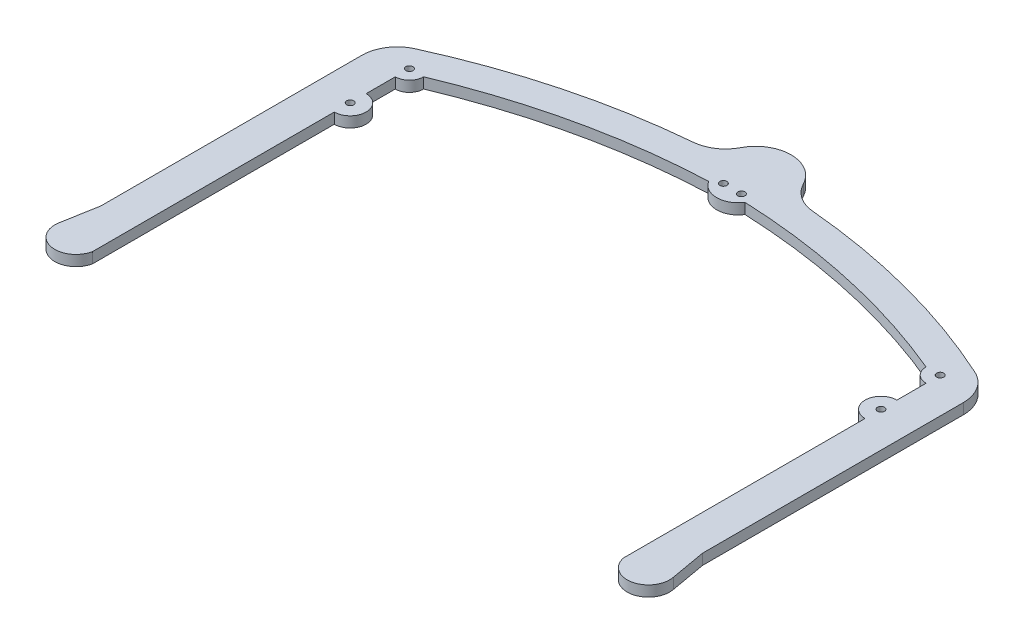
ISO-10303-21;
HEADER;
FILE_DESCRIPTION(('STEP AP214'),'2;1');
FILE_NAME('part.step','',(''),(''),'','','');
FILE_SCHEMA(('AUTOMOTIVE_DESIGN { 1 0 10303 214 1 1 1 1 }'));
ENDSEC;
DATA;
#1=APPLICATION_CONTEXT('core data for automotive mechanical design processes');
#2=APPLICATION_PROTOCOL_DEFINITION('international standard','automotive_design',2000,#1);
#3=PRODUCT_CONTEXT('',#1,'mechanical');
#4=PRODUCT('Part','Part','',(#3));
#5=PRODUCT_RELATED_PRODUCT_CATEGORY('part','',(#4));
#6=PRODUCT_DEFINITION_FORMATION('','',#4);
#7=PRODUCT_DEFINITION_CONTEXT('part definition',#1,'design');
#8=PRODUCT_DEFINITION('design','',#6,#7);
#9=PRODUCT_DEFINITION_SHAPE('','',#8);
#10=(LENGTH_UNIT() NAMED_UNIT(*) SI_UNIT(.MILLI.,.METRE.));
#11=(NAMED_UNIT(*) PLANE_ANGLE_UNIT() SI_UNIT($,.RADIAN.));
#12=(NAMED_UNIT(*) SI_UNIT($,.STERADIAN.) SOLID_ANGLE_UNIT());
#13=UNCERTAINTY_MEASURE_WITH_UNIT(LENGTH_MEASURE(1.E-05),#10,'distance_accuracy_value','');
#14=(GEOMETRIC_REPRESENTATION_CONTEXT(3) GLOBAL_UNCERTAINTY_ASSIGNED_CONTEXT((#13)) GLOBAL_UNIT_ASSIGNED_CONTEXT((#10,
#11,#12)) REPRESENTATION_CONTEXT('',''));
#15=CARTESIAN_POINT('',(0.,0.,0.));
#16=DIRECTION('',(0.,0.,1.));
#17=DIRECTION('',(1.,0.,0.));
#18=AXIS2_PLACEMENT_3D('',#15,#16,#17);
#19=CARTESIAN_POINT('',(-75.0000000000001,3.,-7.81240128822058E-13));
#20=DIRECTION('',(1.,0.,0.));
#21=DIRECTION('',(0.,0.,-1.));
#22=AXIS2_PLACEMENT_3D('',#19,#20,#21);
#23=PLANE('',#22);
#24=DIRECTION('',(0.,0.,1.));
#25=VECTOR('',#24,1.);
#26=CARTESIAN_POINT('',(-75.0000000000001,3.,-7.81240128822058E-13));
#27=LINE('',#26,#25);
#28=CARTESIAN_POINT('',(-74.9999999999991,3.,-90.3372231093292));
#29=VERTEX_POINT('',#28);
#30=CARTESIAN_POINT('',(-75.0000000000006,3.,-82.1033293861665));
#31=VERTEX_POINT('',#30);
#32=EDGE_CURVE('E205',#29,#31,#27,.T.);
#33=ORIENTED_EDGE('',*,*,#32,.T.);
#34=DIRECTION('',(0.,1.,0.));
#35=VECTOR('',#34,1.);
#36=CARTESIAN_POINT('',(-75.0000000000006,0.,-82.1033293861665));
#37=LINE('',#36,#35);
#38=CARTESIAN_POINT('',(-75.0000000000006,0.,-82.1033293861665));
#39=VERTEX_POINT('',#38);
#40=EDGE_CURVE('E196',#39,#31,#37,.T.);
#41=ORIENTED_EDGE('',*,*,#40,.F.);
#42=DIRECTION('',(0.,0.,1.));
#43=VECTOR('',#42,1.);
#44=CARTESIAN_POINT('',(-75.0000000000001,0.,-7.81240128822058E-13));
#45=LINE('',#44,#43);
#46=CARTESIAN_POINT('',(-74.9999999999991,0.,-90.3372231093292));
#47=VERTEX_POINT('',#46);
#48=EDGE_CURVE('E203',#47,#39,#45,.T.);
#49=ORIENTED_EDGE('',*,*,#48,.F.);
#50=DIRECTION('',(0.,1.,0.));
#51=VECTOR('',#50,1.);
#52=CARTESIAN_POINT('',(-75.0000000000006,0.,-90.3372231093292));
#53=LINE('',#52,#51);
#54=EDGE_CURVE('E58',#47,#29,#53,.T.);
#55=ORIENTED_EDGE('',*,*,#54,.T.);
#56=EDGE_LOOP('',(#33,#41,#49,#55));
#57=FACE_BOUND('',#56,.T.);
#58=ADVANCED_FACE('F35',(#57),#23,.T.);
#59=CARTESIAN_POINT('',(-74.9999999999993,0.,-73.1033293861664));
#60=VERTEX_POINT('',#59);
#61=CARTESIAN_POINT('',(-75.,0.,-4.81409491887797));
#62=VERTEX_POINT('',#61);
#63=EDGE_CURVE('E213',#60,#62,#45,.T.);
#64=ORIENTED_EDGE('',*,*,#63,.F.);
#65=DIRECTION('',(0.,1.,0.));
#66=VECTOR('',#65,1.);
#67=CARTESIAN_POINT('',(-75.0000000000005,0.,-73.1033293861664));
#68=LINE('',#67,#66);
#69=CARTESIAN_POINT('',(-75.0000000000005,3.,-73.1033293861664));
#70=VERTEX_POINT('',#69);
#71=EDGE_CURVE('E50',#60,#70,#68,.T.);
#72=ORIENTED_EDGE('',*,*,#71,.T.);
#73=CARTESIAN_POINT('',(-75.,3.,-4.81409491887797));
#74=VERTEX_POINT('',#73);
#75=EDGE_CURVE('E341',#70,#74,#27,.T.);
#76=ORIENTED_EDGE('',*,*,#75,.T.);
#77=DIRECTION('',(0.,-1.,0.));
#78=VECTOR('',#77,1.);
#79=CARTESIAN_POINT('',(-75.,3.,-4.81409491887797));
#80=LINE('',#79,#78);
#81=EDGE_CURVE('E221',#74,#62,#80,.T.);
#82=ORIENTED_EDGE('',*,*,#81,.T.);
#83=EDGE_LOOP('',(#64,#72,#76,#82));
#84=FACE_BOUND('',#83,.T.);
#85=ADVANCED_FACE('F377',(#84),#23,.T.);
#86=CARTESIAN_POINT('',(2.8095896277878,3.,81.4183887611817));
#87=DIRECTION('',(0.,-1.,0.));
#88=DIRECTION('',(0.,0.,-1.));
#89=AXIS2_PLACEMENT_3D('',#86,#87,#88);
#90=CYLINDRICAL_SURFACE('',#89,190.625);
#91=CARTESIAN_POINT('',(2.8095896277878,3.,81.4183887611817));
#92=DIRECTION('',(0.,-1.,0.));
#93=DIRECTION('',(0.,0.,1.));
#94=AXIS2_PLACEMENT_3D('',#91,#92,#93);
#95=CIRCLE('',#94,190.625);
#96=CARTESIAN_POINT('',(-5.11037617875689,3.,-109.042013334958));
#97=VERTEX_POINT('',#96);
#98=CARTESIAN_POINT('',(-71.0000000000003,3.,-94.337223109329));
#99=VERTEX_POINT('',#98);
#100=EDGE_CURVE('E225',#97,#99,#95,.F.);
#101=ORIENTED_EDGE('',*,*,#100,.T.);
#102=DIRECTION('',(0.,1.,0.));
#103=VECTOR('',#102,1.);
#104=CARTESIAN_POINT('',(-71.0000000000001,0.,-94.3372231093286));
#105=LINE('',#104,#103);
#106=CARTESIAN_POINT('',(-71.0000000000003,0.,-94.337223109329));
#107=VERTEX_POINT('',#106);
#108=EDGE_CURVE('E495',#107,#99,#105,.T.);
#109=ORIENTED_EDGE('',*,*,#108,.F.);
#110=CARTESIAN_POINT('',(2.8095896277878,0.,81.4183887611817));
#111=DIRECTION('',(0.,-1.,0.));
#112=DIRECTION('',(0.,0.,1.));
#113=AXIS2_PLACEMENT_3D('',#110,#111,#112);
#114=CIRCLE('',#113,190.625);
#115=CARTESIAN_POINT('',(-5.11037617875689,0.,-109.042013334958));
#116=VERTEX_POINT('',#115);
#117=EDGE_CURVE('E212',#116,#107,#114,.F.);
#118=ORIENTED_EDGE('',*,*,#117,.F.);
#119=DIRECTION('',(0.,1.,0.));
#120=VECTOR('',#119,1.);
#121=CARTESIAN_POINT('',(-5.11037617875712,0.,-109.042013334958));
#122=LINE('',#121,#120);
#123=EDGE_CURVE('E469',#116,#97,#122,.T.);
#124=ORIENTED_EDGE('',*,*,#123,.T.);
#125=EDGE_LOOP('',(#101,#109,#118,#124));
#126=FACE_BOUND('',#125,.T.);
#127=ADVANCED_FACE('F382',(#126),#90,.F.);
#128=CARTESIAN_POINT('',(75.0000000000001,3.,0.));
#129=DIRECTION('',(1.,0.,0.));
#130=DIRECTION('',(0.,0.,-1.));
#131=AXIS2_PLACEMENT_3D('',#128,#129,#130);
#132=PLANE('',#131);
#133=DIRECTION('',(0.,0.,1.));
#134=VECTOR('',#133,1.);
#135=CARTESIAN_POINT('',(75.0000000000001,0.,0.));
#136=LINE('',#135,#134);
#137=CARTESIAN_POINT('',(75.,0.,-90.3372231093297));
#138=VERTEX_POINT('',#137);
#139=CARTESIAN_POINT('',(75.,0.,-82.103329386167));
#140=VERTEX_POINT('',#139);
#141=EDGE_CURVE('E256',#138,#140,#136,.T.);
#142=ORIENTED_EDGE('',*,*,#141,.T.);
#143=DIRECTION('',(0.,1.,0.));
#144=VECTOR('',#143,1.);
#145=CARTESIAN_POINT('',(75.,0.,-82.103329386167));
#146=LINE('',#145,#144);
#147=CARTESIAN_POINT('',(75.,3.,-82.103329386167));
#148=VERTEX_POINT('',#147);
#149=EDGE_CURVE('E461',#140,#148,#146,.T.);
#150=ORIENTED_EDGE('',*,*,#149,.T.);
#151=DIRECTION('',(0.,0.,1.));
#152=VECTOR('',#151,1.);
#153=CARTESIAN_POINT('',(75.0000000000001,3.,0.));
#154=LINE('',#153,#152);
#155=CARTESIAN_POINT('',(75.,3.,-90.3372231093297));
#156=VERTEX_POINT('',#155);
#157=EDGE_CURVE('E238',#156,#148,#154,.T.);
#158=ORIENTED_EDGE('',*,*,#157,.F.);
#159=DIRECTION('',(0.,1.,0.));
#160=VECTOR('',#159,1.);
#161=CARTESIAN_POINT('',(75.,0.,-90.3372231093297));
#162=LINE('',#161,#160);
#163=EDGE_CURVE('E480',#138,#156,#162,.T.);
#164=ORIENTED_EDGE('',*,*,#163,.F.);
#165=EDGE_LOOP('',(#142,#150,#158,#164));
#166=FACE_BOUND('',#165,.T.);
#167=ADVANCED_FACE('F422',(#166),#132,.F.);
#168=CARTESIAN_POINT('',(-2.80958962778857,3.,81.4183887611817));
#169=DIRECTION('',(0.,-1.,0.));
#170=DIRECTION('',(0.,0.,-1.));
#171=AXIS2_PLACEMENT_3D('',#168,#169,#170);
#172=CYLINDRICAL_SURFACE('',#171,190.625);
#173=CARTESIAN_POINT('',(-2.80958962778857,0.,81.4183887611817));
#174=DIRECTION('',(0.,1.,0.));
#175=DIRECTION('',(0.,0.,1.));
#176=AXIS2_PLACEMENT_3D('',#173,#174,#175);
#177=CIRCLE('',#176,190.625);
#178=CARTESIAN_POINT('',(5.11037617875639,0.,-109.042013334958));
#179=VERTEX_POINT('',#178);
#180=CARTESIAN_POINT('',(70.9999999999995,0.,-94.3372231093291));
#181=VERTEX_POINT('',#180);
#182=EDGE_CURVE('E253',#179,#181,#177,.F.);
#183=ORIENTED_EDGE('',*,*,#182,.T.);
#184=DIRECTION('',(0.,1.,0.));
#185=VECTOR('',#184,1.);
#186=CARTESIAN_POINT('',(70.9999999999995,0.,-94.3372231093291));
#187=LINE('',#186,#185);
#188=CARTESIAN_POINT('',(70.9999999999995,3.,-94.3372231093291));
#189=VERTEX_POINT('',#188);
#190=EDGE_CURVE('E477',#181,#189,#187,.T.);
#191=ORIENTED_EDGE('',*,*,#190,.T.);
#192=CARTESIAN_POINT('',(-2.80958962778857,3.,81.4183887611817));
#193=DIRECTION('',(0.,1.,0.));
#194=DIRECTION('',(0.,0.,1.));
#195=AXIS2_PLACEMENT_3D('',#192,#193,#194);
#196=CIRCLE('',#195,190.625);
#197=CARTESIAN_POINT('',(5.11037617875639,3.,-109.042013334958));
#198=VERTEX_POINT('',#197);
#199=EDGE_CURVE('E233',#198,#189,#196,.F.);
#200=ORIENTED_EDGE('',*,*,#199,.F.);
#201=DIRECTION('',(0.,1.,0.));
#202=VECTOR('',#201,1.);
#203=CARTESIAN_POINT('',(5.11037617875639,0.,-109.042013334958));
#204=LINE('',#203,#202);
#205=EDGE_CURVE('E334',#179,#198,#204,.T.);
#206=ORIENTED_EDGE('',*,*,#205,.F.);
#207=EDGE_LOOP('',(#183,#191,#200,#206));
#208=FACE_BOUND('',#207,.T.);
#209=ADVANCED_FACE('F423',(#208),#172,.F.);
#210=CARTESIAN_POINT('',(0.,3.,-117.185905081123));
#211=DIRECTION('',(0.,-1.,0.));
#212=DIRECTION('',(0.,0.,-1.));
#213=AXIS2_PLACEMENT_3D('',#210,#211,#212);
#214=CYLINDRICAL_SURFACE('',#213,10.);
#215=CARTESIAN_POINT('',(0.,0.,-117.185905081123));
#216=DIRECTION('',(0.,1.,0.));
#217=DIRECTION('',(0.,0.,1.));
#218=AXIS2_PLACEMENT_3D('',#215,#216,#217);
#219=CIRCLE('',#218,10.);
#220=CARTESIAN_POINT('',(-8.87578893011517,0.,-121.792462458172));
#221=VERTEX_POINT('',#220);
#222=CARTESIAN_POINT('',(8.87578893011505,0.,-121.792462458172));
#223=VERTEX_POINT('',#222);
#224=EDGE_CURVE('E230',#221,#223,#219,.F.);
#225=ORIENTED_EDGE('',*,*,#224,.F.);
#226=DIRECTION('',(0.,-1.,0.));
#227=VECTOR('',#226,1.);
#228=CARTESIAN_POINT('',(-8.87578893011517,3.,-121.792462458172));
#229=LINE('',#228,#227);
#230=CARTESIAN_POINT('',(-8.87578893011517,3.,-121.792462458172));
#231=VERTEX_POINT('',#230);
#232=EDGE_CURVE('E299',#221,#231,#229,.F.);
#233=ORIENTED_EDGE('',*,*,#232,.T.);
#234=CARTESIAN_POINT('',(0.,3.,-117.185905081123));
#235=DIRECTION('',(0.,1.,0.));
#236=DIRECTION('',(0.,0.,1.));
#237=AXIS2_PLACEMENT_3D('',#234,#235,#236);
#238=CIRCLE('',#237,10.);
#239=CARTESIAN_POINT('',(8.87578893011505,3.,-121.792462458172));
#240=VERTEX_POINT('',#239);
#241=EDGE_CURVE('E231',#231,#240,#238,.F.);
#242=ORIENTED_EDGE('',*,*,#241,.T.);
#243=DIRECTION('',(0.,-1.,0.));
#244=VECTOR('',#243,1.);
#245=CARTESIAN_POINT('',(8.87578893011506,3.,-121.792462458172));
#246=LINE('',#245,#244);
#247=EDGE_CURVE('E275',#240,#223,#246,.T.);
#248=ORIENTED_EDGE('',*,*,#247,.T.);
#249=EDGE_LOOP('',(#225,#233,#242,#248));
#250=FACE_BOUND('',#249,.T.);
#251=ADVANCED_FACE('F316',(#250),#214,.T.);
#252=CARTESIAN_POINT('',(75.,3.,-73.1033293861669));
#253=VERTEX_POINT('',#252);
#254=CARTESIAN_POINT('',(75.0000000000001,3.,-4.81409491887726));
#255=VERTEX_POINT('',#254);
#256=EDGE_CURVE('E237',#253,#255,#154,.T.);
#257=ORIENTED_EDGE('',*,*,#256,.F.);
#258=DIRECTION('',(0.,1.,0.));
#259=VECTOR('',#258,1.);
#260=CARTESIAN_POINT('',(75.,0.,-73.1033293861669));
#261=LINE('',#260,#259);
#262=CARTESIAN_POINT('',(75.,0.,-73.1033293861669));
#263=VERTEX_POINT('',#262);
#264=EDGE_CURVE('E455',#263,#253,#261,.T.);
#265=ORIENTED_EDGE('',*,*,#264,.F.);
#266=CARTESIAN_POINT('',(75.0000000000001,0.,-4.81409491887726));
#267=VERTEX_POINT('',#266);
#268=EDGE_CURVE('E255',#263,#267,#136,.T.);
#269=ORIENTED_EDGE('',*,*,#268,.T.);
#270=DIRECTION('',(0.,-1.,0.));
#271=VECTOR('',#270,1.);
#272=CARTESIAN_POINT('',(75.0000000000001,3.,-4.81409491887726));
#273=LINE('',#272,#271);
#274=EDGE_CURVE('E272',#255,#267,#273,.T.);
#275=ORIENTED_EDGE('',*,*,#274,.F.);
#276=EDGE_LOOP('',(#257,#265,#269,#275));
#277=FACE_BOUND('',#276,.T.);
#278=ADVANCED_FACE('F417',(#277),#132,.F.);
#279=CARTESIAN_POINT('',(80.8816349035424,3.,-6.00000000000001));
#280=DIRECTION('',(0.,-1.,0.));
#281=DIRECTION('',(0.,0.,-1.));
#282=AXIS2_PLACEMENT_3D('',#279,#280,#281);
#283=CYLINDRICAL_SURFACE('',#282,6.00000000000001);
#284=CARTESIAN_POINT('',(80.8816349035424,0.,-6.00000000000001));
#285=DIRECTION('',(0.,1.,0.));
#286=DIRECTION('',(0.,0.,1.));
#287=AXIS2_PLACEMENT_3D('',#284,#285,#286);
#288=CIRCLE('',#287,6.00000000000001);
#289=CARTESIAN_POINT('',(86.7632698070847,0.,-7.18590508112276));
#290=VERTEX_POINT('',#289);
#291=EDGE_CURVE('E258',#267,#290,#288,.T.);
#292=ORIENTED_EDGE('',*,*,#291,.T.);
#293=DIRECTION('',(0.,-1.,0.));
#294=VECTOR('',#293,1.);
#295=CARTESIAN_POINT('',(86.7632698070847,3.,-7.18590508112276));
#296=LINE('',#295,#294);
#297=CARTESIAN_POINT('',(86.7632698070847,3.,-7.18590508112276));
#298=VERTEX_POINT('',#297);
#299=EDGE_CURVE('E270',#298,#290,#296,.T.);
#300=ORIENTED_EDGE('',*,*,#299,.F.);
#301=CARTESIAN_POINT('',(80.8816349035424,3.,-6.00000000000001));
#302=DIRECTION('',(0.,1.,0.));
#303=DIRECTION('',(0.,0.,1.));
#304=AXIS2_PLACEMENT_3D('',#301,#302,#303);
#305=CIRCLE('',#304,6.00000000000001);
#306=EDGE_CURVE('E241',#255,#298,#305,.T.);
#307=ORIENTED_EDGE('',*,*,#306,.F.);
#308=ORIENTED_EDGE('',*,*,#274,.T.);
#309=EDGE_LOOP('',(#292,#300,#307,#308));
#310=FACE_BOUND('',#309,.T.);
#311=ADVANCED_FACE('F413',(#310),#283,.T.);
#312=CARTESIAN_POINT('',(85.3758992429143,3.,-15.0540745387747));
#313=DIRECTION('',(0.984807753012205,0.,-0.173648177666948));
#314=DIRECTION('',(-0.173648177666948,0.,-0.984807753012205));
#315=AXIS2_PLACEMENT_3D('',#312,#313,#314);
#316=PLANE('',#315);
#317=DIRECTION('',(0.173648177666948,0.,0.984807753012205));
#318=VECTOR('',#317,1.);
#319=CARTESIAN_POINT('',(85.3758992429143,0.,-15.0540745387747));
#320=LINE('',#319,#318);
#321=CARTESIAN_POINT('',(85.,0.,-17.1859050811222));
#322=VERTEX_POINT('',#321);
#323=EDGE_CURVE('E261',#322,#290,#320,.T.);
#324=ORIENTED_EDGE('',*,*,#323,.F.);
#325=DIRECTION('',(0.,-1.,0.));
#326=VECTOR('',#325,1.);
#327=CARTESIAN_POINT('',(85.,3.,-17.1859050811222));
#328=LINE('',#327,#326);
#329=CARTESIAN_POINT('',(85.,3.,-17.1859050811222));
#330=VERTEX_POINT('',#329);
#331=EDGE_CURVE('E251',#330,#322,#328,.T.);
#332=ORIENTED_EDGE('',*,*,#331,.F.);
#333=DIRECTION('',(0.173648177666948,0.,0.984807753012205));
#334=VECTOR('',#333,1.);
#335=CARTESIAN_POINT('',(85.3758992429143,3.,-15.0540745387747));
#336=LINE('',#335,#334);
#337=EDGE_CURVE('E243',#330,#298,#336,.T.);
#338=ORIENTED_EDGE('',*,*,#337,.T.);
#339=ORIENTED_EDGE('',*,*,#299,.T.);
#340=EDGE_LOOP('',(#324,#332,#338,#339));
#341=FACE_BOUND('',#340,.T.);
#342=ADVANCED_FACE('F409',(#341),#316,.T.);
#343=CARTESIAN_POINT('',(85.,3.,0.));
#344=DIRECTION('',(1.,0.,0.));
#345=DIRECTION('',(0.,0.,-1.));
#346=AXIS2_PLACEMENT_3D('',#343,#344,#345);
#347=PLANE('',#346);
#348=DIRECTION('',(0.,0.,1.));
#349=VECTOR('',#348,1.);
#350=CARTESIAN_POINT('',(85.,0.,0.));
#351=LINE('',#350,#349);
#352=CARTESIAN_POINT('',(85.,0.,-90.8788609623958));
#353=VERTEX_POINT('',#352);
#354=EDGE_CURVE('E264',#353,#322,#351,.T.);
#355=ORIENTED_EDGE('',*,*,#354,.F.);
#356=DIRECTION('',(0.,-1.,0.));
#357=VECTOR('',#356,1.);
#358=CARTESIAN_POINT('',(85.,3.,-90.8788609623958));
#359=LINE('',#358,#357);
#360=CARTESIAN_POINT('',(85.,3.,-90.8788609623958));
#361=VERTEX_POINT('',#360);
#362=EDGE_CURVE('E285',#353,#361,#359,.F.);
#363=ORIENTED_EDGE('',*,*,#362,.T.);
#364=DIRECTION('',(0.,0.,1.));
#365=VECTOR('',#364,1.);
#366=CARTESIAN_POINT('',(85.,3.,0.));
#367=LINE('',#366,#365);
#368=EDGE_CURVE('E246',#361,#330,#367,.T.);
#369=ORIENTED_EDGE('',*,*,#368,.T.);
#370=ORIENTED_EDGE('',*,*,#331,.T.);
#371=EDGE_LOOP('',(#355,#363,#369,#370));
#372=FACE_BOUND('',#371,.T.);
#373=ADVANCED_FACE('F405',(#372),#347,.T.);
#374=CARTESIAN_POINT('',(0.,3.,73.4390949188776));
#375=DIRECTION('',(0.,-1.,0.));
#376=DIRECTION('',(0.,0.,-1.));
#377=AXIS2_PLACEMENT_3D('',#374,#375,#376);
#378=CYLINDRICAL_SURFACE('',#377,190.625);
#379=CARTESIAN_POINT('',(0.,0.,73.4390949188776));
#380=DIRECTION('',(0.,1.,0.));
#381=DIRECTION('',(0.,0.,1.));
#382=AXIS2_PLACEMENT_3D('',#379,#380,#381);
#383=CIRCLE('',#382,190.625);
#384=CARTESIAN_POINT('',(16.8667640104991,0.,-116.438241529721));
#385=VERTEX_POINT('',#384);
#386=CARTESIAN_POINT('',(79.1522491349481,0.,-99.9760488312552));
#387=VERTEX_POINT('',#386);
#388=EDGE_CURVE('E234',#385,#387,#383,.F.);
#389=ORIENTED_EDGE('',*,*,#388,.F.);
#390=DIRECTION('',(0.,-1.,0.));
#391=VECTOR('',#390,1.);
#392=CARTESIAN_POINT('',(16.8667640104991,3.,-116.438241529721));
#393=LINE('',#392,#391);
#394=CARTESIAN_POINT('',(16.8667640104991,3.,-116.438241529721));
#395=VERTEX_POINT('',#394);
#396=EDGE_CURVE('E281',#385,#395,#393,.F.);
#397=ORIENTED_EDGE('',*,*,#396,.T.);
#398=CARTESIAN_POINT('',(0.,3.,73.4390949188776));
#399=DIRECTION('',(0.,1.,0.));
#400=DIRECTION('',(0.,0.,1.));
#401=AXIS2_PLACEMENT_3D('',#398,#399,#400);
#402=CIRCLE('',#401,190.625);
#403=CARTESIAN_POINT('',(79.1522491349481,3.,-99.9760488312552));
#404=VERTEX_POINT('',#403);
#405=EDGE_CURVE('E248',#395,#404,#402,.F.);
#406=ORIENTED_EDGE('',*,*,#405,.T.);
#407=DIRECTION('',(0.,-1.,0.));
#408=VECTOR('',#407,1.);
#409=CARTESIAN_POINT('',(79.1522491349481,3.,-99.9760488312553));
#410=LINE('',#409,#408);
#411=EDGE_CURVE('E278',#404,#387,#410,.T.);
#412=ORIENTED_EDGE('',*,*,#411,.T.);
#413=EDGE_LOOP('',(#389,#397,#406,#412));
#414=FACE_BOUND('',#413,.T.);
#415=ADVANCED_FACE('F397',(#414),#378,.T.);
#416=CARTESIAN_POINT('',(0.,3.,0.));
#417=DIRECTION('',(0.,1.,0.));
#418=DIRECTION('',(0.,0.,1.));
#419=AXIS2_PLACEMENT_3D('',#416,#417,#418);
#420=PLANE('',#419);
#421=CARTESIAN_POINT('',(-2.55518808937819,3.,-110.61395920804));
#422=DIRECTION('',(0.,1.,0.));
#423=DIRECTION('',(0.,0.,1.));
#424=AXIS2_PLACEMENT_3D('',#421,#422,#423);
#425=CIRCLE('',#424,1.);
#426=CARTESIAN_POINT('',(-2.55518808937819,3.,-109.61395920804));
#427=VERTEX_POINT('',#426);
#428=EDGE_CURVE('E816',#427,#427,#425,.T.);
#429=ORIENTED_EDGE('',*,*,#428,.F.);
#430=EDGE_LOOP('',(#429));
#431=FACE_BOUND('',#430,.T.);
#432=CARTESIAN_POINT('',(-75.,3.,-94.3372231093291));
#433=DIRECTION('',(0.,1.,0.));
#434=DIRECTION('',(0.,0.,1.));
#435=AXIS2_PLACEMENT_3D('',#432,#433,#434);
#436=CIRCLE('',#435,1.);
#437=CARTESIAN_POINT('',(-75.,3.,-93.3372231093291));
#438=VERTEX_POINT('',#437);
#439=EDGE_CURVE('E810',#438,#438,#436,.T.);
#440=ORIENTED_EDGE('',*,*,#439,.F.);
#441=EDGE_LOOP('',(#440));
#442=FACE_BOUND('',#441,.T.);
#443=CARTESIAN_POINT('',(-75.,3.,-77.6033293861669));
#444=DIRECTION('',(0.,1.,0.));
#445=DIRECTION('',(0.,0.,1.));
#446=AXIS2_PLACEMENT_3D('',#443,#444,#445);
#447=CIRCLE('',#446,1.);
#448=CARTESIAN_POINT('',(-75.,3.,-76.6033293861669));
#449=VERTEX_POINT('',#448);
#450=EDGE_CURVE('E804',#449,#449,#447,.T.);
#451=ORIENTED_EDGE('',*,*,#450,.F.);
#452=EDGE_LOOP('',(#451));
#453=FACE_BOUND('',#452,.T.);
#454=CARTESIAN_POINT('',(2.55518808937819,3.,-110.61395920804));
#455=DIRECTION('',(0.,1.,0.));
#456=DIRECTION('',(0.,0.,1.));
#457=AXIS2_PLACEMENT_3D('',#454,#455,#456);
#458=CIRCLE('',#457,1.);
#459=CARTESIAN_POINT('',(2.55518808937819,3.,-109.61395920804));
#460=VERTEX_POINT('',#459);
#461=EDGE_CURVE('E798',#460,#460,#458,.T.);
#462=ORIENTED_EDGE('',*,*,#461,.F.);
#463=EDGE_LOOP('',(#462));
#464=FACE_BOUND('',#463,.T.);
#465=CARTESIAN_POINT('',(75.,3.,-94.3372231093291));
#466=DIRECTION('',(0.,1.,0.));
#467=DIRECTION('',(0.,0.,1.));
#468=AXIS2_PLACEMENT_3D('',#465,#466,#467);
#469=CIRCLE('',#468,1.);
#470=CARTESIAN_POINT('',(75.,3.,-93.3372231093291));
#471=VERTEX_POINT('',#470);
#472=EDGE_CURVE('E789',#471,#471,#469,.T.);
#473=ORIENTED_EDGE('',*,*,#472,.F.);
#474=EDGE_LOOP('',(#473));
#475=FACE_BOUND('',#474,.T.);
#476=CARTESIAN_POINT('',(75.,3.,-77.6033293861669));
#477=DIRECTION('',(0.,1.,0.));
#478=DIRECTION('',(0.,0.,1.));
#479=AXIS2_PLACEMENT_3D('',#476,#477,#478);
#480=CIRCLE('',#479,1.);
#481=CARTESIAN_POINT('',(75.,3.,-76.6033293861669));
#482=VERTEX_POINT('',#481);
#483=EDGE_CURVE('E783',#482,#482,#480,.T.);
#484=ORIENTED_EDGE('',*,*,#483,.F.);
#485=EDGE_LOOP('',(#484));
#486=FACE_BOUND('',#485,.T.);
#487=ORIENTED_EDGE('',*,*,#32,.F.);
#488=CARTESIAN_POINT('',(-75.0000000000007,3.,-94.3372231093292));
#489=DIRECTION('',(0.,-1.,0.));
#490=DIRECTION('',(0.,0.,1.));
#491=AXIS2_PLACEMENT_3D('',#488,#489,#490);
#492=CIRCLE('',#491,4.);
#493=EDGE_CURVE('E206',#99,#29,#492,.T.);
#494=ORIENTED_EDGE('',*,*,#493,.F.);
#495=ORIENTED_EDGE('',*,*,#100,.F.);
#496=CARTESIAN_POINT('',(0.,3.,-112.185905081123));
#497=DIRECTION('',(0.,1.,0.));
#498=DIRECTION('',(0.,0.,1.));
#499=AXIS2_PLACEMENT_3D('',#496,#497,#498);
#500=CIRCLE('',#499,6.);
#501=EDGE_CURVE('E483',#198,#97,#500,.F.);
#502=ORIENTED_EDGE('',*,*,#501,.F.);
#503=ORIENTED_EDGE('',*,*,#199,.T.);
#504=CARTESIAN_POINT('',(75.,3.,-94.3372231093297));
#505=DIRECTION('',(0.,1.,0.));
#506=DIRECTION('',(0.,0.,1.));
#507=AXIS2_PLACEMENT_3D('',#504,#505,#506);
#508=CIRCLE('',#507,4.);
#509=EDGE_CURVE('E460',#189,#156,#508,.T.);
#510=ORIENTED_EDGE('',*,*,#509,.T.);
#511=ORIENTED_EDGE('',*,*,#157,.T.);
#512=CARTESIAN_POINT('',(75.,3.,-77.6033293861669));
#513=DIRECTION('',(0.,1.,0.));
#514=DIRECTION('',(0.,0.,1.));
#515=AXIS2_PLACEMENT_3D('',#512,#513,#514);
#516=CIRCLE('',#515,4.50000000000002);
#517=EDGE_CURVE('E466',#148,#253,#516,.T.);
#518=ORIENTED_EDGE('',*,*,#517,.T.);
#519=ORIENTED_EDGE('',*,*,#256,.T.);
#520=ORIENTED_EDGE('',*,*,#306,.T.);
#521=ORIENTED_EDGE('',*,*,#337,.F.);
#522=ORIENTED_EDGE('',*,*,#368,.F.);
#523=CARTESIAN_POINT('',(75.,3.,-90.8788609623958));
#524=DIRECTION('',(0.,1.,0.));
#525=DIRECTION('',(0.,0.,1.));
#526=AXIS2_PLACEMENT_3D('',#523,#524,#525);
#527=CIRCLE('',#526,10.);
#528=EDGE_CURVE('E287',#361,#404,#527,.T.);
#529=ORIENTED_EDGE('',*,*,#528,.T.);
#530=ORIENTED_EDGE('',*,*,#405,.F.);
#531=CARTESIAN_POINT('',(17.7515778602302,3.,-126.399019835221));
#532=DIRECTION('',(0.,1.,0.));
#533=DIRECTION('',(0.,0.,1.));
#534=AXIS2_PLACEMENT_3D('',#531,#532,#533);
#535=CIRCLE('',#534,10.);
#536=EDGE_CURVE('E291',#395,#240,#535,.F.);
#537=ORIENTED_EDGE('',*,*,#536,.T.);
#538=ORIENTED_EDGE('',*,*,#241,.F.);
#539=CARTESIAN_POINT('',(-17.7515778602303,3.,-126.399019835221));
#540=DIRECTION('',(0.,1.,0.));
#541=DIRECTION('',(0.,0.,1.));
#542=AXIS2_PLACEMENT_3D('',#539,#540,#541);
#543=CIRCLE('',#542,10.);
#544=CARTESIAN_POINT('',(-16.8667640104992,3.,-116.438241529721));
#545=VERTEX_POINT('',#544);
#546=EDGE_CURVE('E11',#231,#545,#543,.F.);
#547=ORIENTED_EDGE('',*,*,#546,.T.);
#548=CARTESIAN_POINT('',(-6.95325064206448E-13,3.,73.4390949188776));
#549=DIRECTION('',(0.,-1.,0.));
#550=DIRECTION('',(0.,0.,1.));
#551=AXIS2_PLACEMENT_3D('',#548,#549,#550);
#552=CIRCLE('',#551,190.625);
#553=CARTESIAN_POINT('',(-79.1522491349472,3.,-99.976048831256));
#554=VERTEX_POINT('',#553);
#555=EDGE_CURVE('E215',#545,#554,#552,.F.);
#556=ORIENTED_EDGE('',*,*,#555,.T.);
#557=CARTESIAN_POINT('',(-74.9999999999992,3.,-90.8788609623965));
#558=DIRECTION('',(0.,1.,0.));
#559=DIRECTION('',(0.,0.,1.));
#560=AXIS2_PLACEMENT_3D('',#557,#558,#559);
#561=CIRCLE('',#560,10.);
#562=CARTESIAN_POINT('',(-84.9999999999992,3.,-90.8788609623966));
#563=VERTEX_POINT('',#562);
#564=EDGE_CURVE('E306',#554,#563,#561,.T.);
#565=ORIENTED_EDGE('',*,*,#564,.T.);
#566=DIRECTION('',(0.,0.,1.));
#567=VECTOR('',#566,1.);
#568=CARTESIAN_POINT('',(-85.,3.,-7.90039148556375E-13));
#569=LINE('',#568,#567);
#570=CARTESIAN_POINT('',(-84.9999999999998,3.,-17.185905081123));
#571=VERTEX_POINT('',#570);
#572=EDGE_CURVE('E329',#563,#571,#569,.T.);
#573=ORIENTED_EDGE('',*,*,#572,.T.);
#574=DIRECTION('',(-0.173648177666957,0.,0.984807753012203));
#575=VECTOR('',#574,1.);
#576=CARTESIAN_POINT('',(-85.3758992429141,3.,-15.0540745387755));
#577=LINE('',#576,#575);
#578=CARTESIAN_POINT('',(-86.7632698070847,3.,-7.18590508112358));
#579=VERTEX_POINT('',#578);
#580=EDGE_CURVE('E331',#571,#579,#577,.T.);
#581=ORIENTED_EDGE('',*,*,#580,.T.);
#582=CARTESIAN_POINT('',(-80.8816349035423,3.,-6.00000000000077));
#583=DIRECTION('',(0.,-1.,0.));
#584=DIRECTION('',(0.,0.,1.));
#585=AXIS2_PLACEMENT_3D('',#582,#583,#584);
#586=CIRCLE('',#585,6.00000000000001);
#587=EDGE_CURVE('E338',#74,#579,#586,.T.);
#588=ORIENTED_EDGE('',*,*,#587,.F.);
#589=ORIENTED_EDGE('',*,*,#75,.F.);
#590=CARTESIAN_POINT('',(-75.0000000000005,3.,-77.6033293861665));
#591=DIRECTION('',(0.,-1.,0.));
#592=DIRECTION('',(0.,0.,1.));
#593=AXIS2_PLACEMENT_3D('',#590,#591,#592);
#594=CIRCLE('',#593,4.50000000000002);
#595=EDGE_CURVE('E201',#31,#70,#594,.T.);
#596=ORIENTED_EDGE('',*,*,#595,.F.);
#597=EDGE_LOOP('',(#487,#494,#495,#502,#503,#510,#511,#518,#519,#520,#521,#522,#529,#530,#537,
#538,#547,#556,#565,#573,#581,#588,#589,#596));
#598=FACE_BOUND('',#597,.T.);
#599=ADVANCED_FACE('F324',(#431,#442,#453,#464,#475,#486,#598),#420,.T.);
#600=CARTESIAN_POINT('',(0.,0.,0.));
#601=DIRECTION('',(0.,1.,0.));
#602=DIRECTION('',(0.,0.,1.));
#603=AXIS2_PLACEMENT_3D('',#600,#601,#602);
#604=PLANE('',#603);
#605=CARTESIAN_POINT('',(-2.55518808937819,0.,-110.61395920804));
#606=DIRECTION('',(0.,1.,0.));
#607=DIRECTION('',(0.,0.,1.));
#608=AXIS2_PLACEMENT_3D('',#605,#606,#607);
#609=CIRCLE('',#608,0.999999999999999);
#610=CARTESIAN_POINT('',(-2.55518808937819,0.,-109.61395920804));
#611=VERTEX_POINT('',#610);
#612=EDGE_CURVE('E813',#611,#611,#609,.T.);
#613=ORIENTED_EDGE('',*,*,#612,.T.);
#614=EDGE_LOOP('',(#613));
#615=FACE_BOUND('',#614,.T.);
#616=CARTESIAN_POINT('',(-75.,0.,-94.3372231093291));
#617=DIRECTION('',(0.,1.,0.));
#618=DIRECTION('',(0.,0.,1.));
#619=AXIS2_PLACEMENT_3D('',#616,#617,#618);
#620=CIRCLE('',#619,1.);
#621=CARTESIAN_POINT('',(-75.,0.,-93.3372231093291));
#622=VERTEX_POINT('',#621);
#623=EDGE_CURVE('E807',#622,#622,#620,.T.);
#624=ORIENTED_EDGE('',*,*,#623,.T.);
#625=EDGE_LOOP('',(#624));
#626=FACE_BOUND('',#625,.T.);
#627=CARTESIAN_POINT('',(-75.,0.,-77.6033293861669));
#628=DIRECTION('',(0.,1.,0.));
#629=DIRECTION('',(0.,0.,1.));
#630=AXIS2_PLACEMENT_3D('',#627,#628,#629);
#631=CIRCLE('',#630,1.);
#632=CARTESIAN_POINT('',(-75.,0.,-76.6033293861669));
#633=VERTEX_POINT('',#632);
#634=EDGE_CURVE('E801',#633,#633,#631,.T.);
#635=ORIENTED_EDGE('',*,*,#634,.T.);
#636=EDGE_LOOP('',(#635));
#637=FACE_BOUND('',#636,.T.);
#638=CARTESIAN_POINT('',(2.55518808937819,0.,-110.61395920804));
#639=DIRECTION('',(0.,1.,0.));
#640=DIRECTION('',(0.,0.,1.));
#641=AXIS2_PLACEMENT_3D('',#638,#639,#640);
#642=CIRCLE('',#641,0.999999999999999);
#643=CARTESIAN_POINT('',(2.55518808937819,0.,-109.61395920804));
#644=VERTEX_POINT('',#643);
#645=EDGE_CURVE('E795',#644,#644,#642,.T.);
#646=ORIENTED_EDGE('',*,*,#645,.T.);
#647=EDGE_LOOP('',(#646));
#648=FACE_BOUND('',#647,.T.);
#649=CARTESIAN_POINT('',(75.,0.,-94.3372231093291));
#650=DIRECTION('',(0.,1.,0.));
#651=DIRECTION('',(0.,0.,1.));
#652=AXIS2_PLACEMENT_3D('',#649,#650,#651);
#653=CIRCLE('',#652,1.);
#654=CARTESIAN_POINT('',(75.,0.,-93.3372231093291));
#655=VERTEX_POINT('',#654);
#656=EDGE_CURVE('E785',#655,#655,#653,.T.);
#657=ORIENTED_EDGE('',*,*,#656,.T.);
#658=EDGE_LOOP('',(#657));
#659=FACE_BOUND('',#658,.T.);
#660=CARTESIAN_POINT('',(75.,0.,-77.6033293861669));
#661=DIRECTION('',(0.,1.,0.));
#662=DIRECTION('',(0.,0.,1.));
#663=AXIS2_PLACEMENT_3D('',#660,#661,#662);
#664=CIRCLE('',#663,1.);
#665=CARTESIAN_POINT('',(75.,0.,-76.6033293861669));
#666=VERTEX_POINT('',#665);
#667=EDGE_CURVE('E780',#666,#666,#664,.T.);
#668=ORIENTED_EDGE('',*,*,#667,.T.);
#669=EDGE_LOOP('',(#668));
#670=FACE_BOUND('',#669,.T.);
#671=CARTESIAN_POINT('',(-75.0000000000007,0.,-94.3372231093292));
#672=DIRECTION('',(0.,-1.,0.));
#673=DIRECTION('',(0.,0.,1.));
#674=AXIS2_PLACEMENT_3D('',#671,#672,#673);
#675=CIRCLE('',#674,4.);
#676=EDGE_CURVE('E211',#107,#47,#675,.T.);
#677=ORIENTED_EDGE('',*,*,#676,.T.);
#678=ORIENTED_EDGE('',*,*,#48,.T.);
#679=CARTESIAN_POINT('',(-75.0000000000005,0.,-77.6033293861665));
#680=DIRECTION('',(0.,-1.,0.));
#681=DIRECTION('',(0.,0.,1.));
#682=AXIS2_PLACEMENT_3D('',#679,#680,#681);
#683=CIRCLE('',#682,4.50000000000002);
#684=EDGE_CURVE('E193',#39,#60,#683,.T.);
#685=ORIENTED_EDGE('',*,*,#684,.T.);
#686=ORIENTED_EDGE('',*,*,#63,.T.);
#687=CARTESIAN_POINT('',(-80.8816349035423,0.,-6.00000000000077));
#688=DIRECTION('',(0.,-1.,0.));
#689=DIRECTION('',(0.,0.,1.));
#690=AXIS2_PLACEMENT_3D('',#687,#688,#689);
#691=CIRCLE('',#690,6.00000000000001);
#692=CARTESIAN_POINT('',(-86.7632698070847,0.,-7.18590508112358));
#693=VERTEX_POINT('',#692);
#694=EDGE_CURVE('E217',#62,#693,#691,.T.);
#695=ORIENTED_EDGE('',*,*,#694,.T.);
#696=DIRECTION('',(-0.173648177666957,0.,0.984807753012203));
#697=VECTOR('',#696,1.);
#698=CARTESIAN_POINT('',(-85.3758992429141,0.,-15.0540745387755));
#699=LINE('',#698,#697);
#700=CARTESIAN_POINT('',(-84.9999999999998,0.,-17.185905081123));
#701=VERTEX_POINT('',#700);
#702=EDGE_CURVE('E346',#701,#693,#699,.T.);
#703=ORIENTED_EDGE('',*,*,#702,.F.);
#704=DIRECTION('',(0.,0.,1.));
#705=VECTOR('',#704,1.);
#706=CARTESIAN_POINT('',(-85.,0.,-7.90039148556375E-13));
#707=LINE('',#706,#705);
#708=CARTESIAN_POINT('',(-84.9999999999992,0.,-90.8788609623966));
#709=VERTEX_POINT('',#708);
#710=EDGE_CURVE('E345',#709,#701,#707,.T.);
#711=ORIENTED_EDGE('',*,*,#710,.F.);
#712=CARTESIAN_POINT('',(-74.9999999999992,0.,-90.8788609623965));
#713=DIRECTION('',(0.,1.,0.));
#714=DIRECTION('',(0.,0.,1.));
#715=AXIS2_PLACEMENT_3D('',#712,#713,#714);
#716=CIRCLE('',#715,10.);
#717=CARTESIAN_POINT('',(-79.1522491349472,0.,-99.976048831256));
#718=VERTEX_POINT('',#717);
#719=EDGE_CURVE('E304',#709,#718,#716,.F.);
#720=ORIENTED_EDGE('',*,*,#719,.T.);
#721=CARTESIAN_POINT('',(-6.95325064206448E-13,0.,73.4390949188776));
#722=DIRECTION('',(0.,-1.,0.));
#723=DIRECTION('',(0.,0.,1.));
#724=AXIS2_PLACEMENT_3D('',#721,#722,#723);
#725=CIRCLE('',#724,190.625);
#726=CARTESIAN_POINT('',(-16.8667640104992,0.,-116.438241529721));
#727=VERTEX_POINT('',#726);
#728=EDGE_CURVE('E311',#727,#718,#725,.F.);
#729=ORIENTED_EDGE('',*,*,#728,.F.);
#730=CARTESIAN_POINT('',(-17.7515778602303,0.,-126.399019835221));
#731=DIRECTION('',(0.,1.,0.));
#732=DIRECTION('',(0.,0.,1.));
#733=AXIS2_PLACEMENT_3D('',#730,#731,#732);
#734=CIRCLE('',#733,10.);
#735=EDGE_CURVE('E43',#727,#221,#734,.T.);
#736=ORIENTED_EDGE('',*,*,#735,.T.);
#737=ORIENTED_EDGE('',*,*,#224,.T.);
#738=CARTESIAN_POINT('',(17.7515778602302,0.,-126.399019835221));
#739=DIRECTION('',(0.,1.,0.));
#740=DIRECTION('',(0.,0.,1.));
#741=AXIS2_PLACEMENT_3D('',#738,#739,#740);
#742=CIRCLE('',#741,10.);
#743=EDGE_CURVE('E289',#223,#385,#742,.T.);
#744=ORIENTED_EDGE('',*,*,#743,.T.);
#745=ORIENTED_EDGE('',*,*,#388,.T.);
#746=CARTESIAN_POINT('',(75.,0.,-90.8788609623958));
#747=DIRECTION('',(0.,1.,0.));
#748=DIRECTION('',(0.,0.,1.));
#749=AXIS2_PLACEMENT_3D('',#746,#747,#748);
#750=CIRCLE('',#749,10.);
#751=EDGE_CURVE('E283',#387,#353,#750,.F.);
#752=ORIENTED_EDGE('',*,*,#751,.T.);
#753=ORIENTED_EDGE('',*,*,#354,.T.);
#754=ORIENTED_EDGE('',*,*,#323,.T.);
#755=ORIENTED_EDGE('',*,*,#291,.F.);
#756=ORIENTED_EDGE('',*,*,#268,.F.);
#757=CARTESIAN_POINT('',(75.,0.,-77.6033293861669));
#758=DIRECTION('',(0.,1.,0.));
#759=DIRECTION('',(0.,0.,1.));
#760=AXIS2_PLACEMENT_3D('',#757,#758,#759);
#761=CIRCLE('',#760,4.50000000000002);
#762=EDGE_CURVE('E464',#140,#263,#761,.T.);
#763=ORIENTED_EDGE('',*,*,#762,.F.);
#764=ORIENTED_EDGE('',*,*,#141,.F.);
#765=CARTESIAN_POINT('',(75.,0.,-94.3372231093297));
#766=DIRECTION('',(0.,1.,0.));
#767=DIRECTION('',(0.,0.,1.));
#768=AXIS2_PLACEMENT_3D('',#765,#766,#767);
#769=CIRCLE('',#768,4.);
#770=EDGE_CURVE('E474',#181,#138,#769,.T.);
#771=ORIENTED_EDGE('',*,*,#770,.F.);
#772=ORIENTED_EDGE('',*,*,#182,.F.);
#773=CARTESIAN_POINT('',(0.,0.,-112.185905081123));
#774=DIRECTION('',(0.,1.,0.));
#775=DIRECTION('',(0.,0.,1.));
#776=AXIS2_PLACEMENT_3D('',#773,#774,#775);
#777=CIRCLE('',#776,6.);
#778=EDGE_CURVE('E485',#179,#116,#777,.F.);
#779=ORIENTED_EDGE('',*,*,#778,.T.);
#780=ORIENTED_EDGE('',*,*,#117,.T.);
#781=EDGE_LOOP('',(#677,#678,#685,#686,#695,#703,#711,#720,#729,#736,#737,#744,#745,#752,#753,
#754,#755,#756,#763,#764,#771,#772,#779,#780));
#782=FACE_BOUND('',#781,.T.);
#783=ADVANCED_FACE('F208',(#615,#626,#637,#648,#659,#670,#782),#604,.F.);
#784=CARTESIAN_POINT('',(17.7515778602302,3.,-126.399019835221));
#785=DIRECTION('',(0.,1.,0.));
#786=DIRECTION('',(0.,0.,1.));
#787=AXIS2_PLACEMENT_3D('',#784,#785,#786);
#788=CYLINDRICAL_SURFACE('',#787,10.);
#789=ORIENTED_EDGE('',*,*,#536,.F.);
#790=ORIENTED_EDGE('',*,*,#396,.F.);
#791=ORIENTED_EDGE('',*,*,#743,.F.);
#792=ORIENTED_EDGE('',*,*,#247,.F.);
#793=EDGE_LOOP('',(#789,#790,#791,#792));
#794=FACE_BOUND('',#793,.T.);
#795=ADVANCED_FACE('F401',(#794),#788,.F.);
#796=CARTESIAN_POINT('',(75.,3.,-90.8788609623958));
#797=DIRECTION('',(0.,-1.,0.));
#798=DIRECTION('',(0.,0.,-1.));
#799=AXIS2_PLACEMENT_3D('',#796,#797,#798);
#800=CYLINDRICAL_SURFACE('',#799,10.);
#801=ORIENTED_EDGE('',*,*,#528,.F.);
#802=ORIENTED_EDGE('',*,*,#362,.F.);
#803=ORIENTED_EDGE('',*,*,#751,.F.);
#804=ORIENTED_EDGE('',*,*,#411,.F.);
#805=EDGE_LOOP('',(#801,#802,#803,#804));
#806=FACE_BOUND('',#805,.T.);
#807=ADVANCED_FACE('F394',(#806),#800,.T.);
#808=CARTESIAN_POINT('',(-6.95325064206448E-13,3.,73.4390949188776));
#809=DIRECTION('',(0.,-1.,0.));
#810=DIRECTION('',(0.,0.,-1.));
#811=AXIS2_PLACEMENT_3D('',#808,#809,#810);
#812=CYLINDRICAL_SURFACE('',#811,190.625);
#813=ORIENTED_EDGE('',*,*,#555,.F.);
#814=DIRECTION('',(0.,-1.,0.));
#815=VECTOR('',#814,1.);
#816=CARTESIAN_POINT('',(-16.8667640104992,3.,-116.438241529721));
#817=LINE('',#816,#815);
#818=EDGE_CURVE('E296',#545,#727,#817,.T.);
#819=ORIENTED_EDGE('',*,*,#818,.T.);
#820=ORIENTED_EDGE('',*,*,#728,.T.);
#821=DIRECTION('',(0.,-1.,0.));
#822=VECTOR('',#821,1.);
#823=CARTESIAN_POINT('',(-79.1522491349472,3.,-99.976048831256));
#824=LINE('',#823,#822);
#825=EDGE_CURVE('E294',#718,#554,#824,.F.);
#826=ORIENTED_EDGE('',*,*,#825,.T.);
#827=EDGE_LOOP('',(#813,#819,#820,#826));
#828=FACE_BOUND('',#827,.T.);
#829=ADVANCED_FACE('F327',(#828),#812,.T.);
#830=CARTESIAN_POINT('',(-85.,3.,-7.90039148556375E-13));
#831=DIRECTION('',(1.,0.,0.));
#832=DIRECTION('',(0.,0.,-1.));
#833=AXIS2_PLACEMENT_3D('',#830,#831,#832);
#834=PLANE('',#833);
#835=ORIENTED_EDGE('',*,*,#572,.F.);
#836=DIRECTION('',(0.,-1.,0.));
#837=VECTOR('',#836,1.);
#838=CARTESIAN_POINT('',(-84.9999999999992,3.,-90.8788609623966));
#839=LINE('',#838,#837);
#840=EDGE_CURVE('E301',#563,#709,#839,.T.);
#841=ORIENTED_EDGE('',*,*,#840,.T.);
#842=ORIENTED_EDGE('',*,*,#710,.T.);
#843=DIRECTION('',(0.,-1.,0.));
#844=VECTOR('',#843,1.);
#845=CARTESIAN_POINT('',(-84.9999999999998,3.,-17.185905081123));
#846=LINE('',#845,#844);
#847=EDGE_CURVE('E227',#571,#701,#846,.T.);
#848=ORIENTED_EDGE('',*,*,#847,.F.);
#849=EDGE_LOOP('',(#835,#841,#842,#848));
#850=FACE_BOUND('',#849,.T.);
#851=ADVANCED_FACE('F365',(#850),#834,.F.);
#852=CARTESIAN_POINT('',(-85.3758992429141,3.,-15.0540745387755));
#853=DIRECTION('',(0.984807753012203,0.,0.173648177666957));
#854=DIRECTION('',(0.173648177666957,0.,-0.984807753012204));
#855=AXIS2_PLACEMENT_3D('',#852,#853,#854);
#856=PLANE('',#855);
#857=ORIENTED_EDGE('',*,*,#702,.T.);
#858=DIRECTION('',(0.,-1.,0.));
#859=VECTOR('',#858,1.);
#860=CARTESIAN_POINT('',(-86.7632698070847,3.,-7.18590508112358));
#861=LINE('',#860,#859);
#862=EDGE_CURVE('E224',#579,#693,#861,.T.);
#863=ORIENTED_EDGE('',*,*,#862,.F.);
#864=ORIENTED_EDGE('',*,*,#580,.F.);
#865=ORIENTED_EDGE('',*,*,#847,.T.);
#866=EDGE_LOOP('',(#857,#863,#864,#865));
#867=FACE_BOUND('',#866,.T.);
#868=ADVANCED_FACE('F359',(#867),#856,.F.);
#869=CARTESIAN_POINT('',(-80.8816349035423,3.,-6.00000000000077));
#870=DIRECTION('',(0.,-1.,0.));
#871=DIRECTION('',(0.,0.,-1.));
#872=AXIS2_PLACEMENT_3D('',#869,#870,#871);
#873=CYLINDRICAL_SURFACE('',#872,6.00000000000001);
#874=ORIENTED_EDGE('',*,*,#694,.F.);
#875=ORIENTED_EDGE('',*,*,#81,.F.);
#876=ORIENTED_EDGE('',*,*,#587,.T.);
#877=ORIENTED_EDGE('',*,*,#862,.T.);
#878=EDGE_LOOP('',(#874,#875,#876,#877));
#879=FACE_BOUND('',#878,.T.);
#880=ADVANCED_FACE('F356',(#879),#873,.T.);
#881=CARTESIAN_POINT('',(-17.7515778602303,3.,-126.399019835221));
#882=DIRECTION('',(0.,1.,0.));
#883=DIRECTION('',(0.,0.,1.));
#884=AXIS2_PLACEMENT_3D('',#881,#882,#883);
#885=CYLINDRICAL_SURFACE('',#884,10.);
#886=ORIENTED_EDGE('',*,*,#546,.F.);
#887=ORIENTED_EDGE('',*,*,#232,.F.);
#888=ORIENTED_EDGE('',*,*,#735,.F.);
#889=ORIENTED_EDGE('',*,*,#818,.F.);
#890=EDGE_LOOP('',(#886,#887,#888,#889));
#891=FACE_BOUND('',#890,.T.);
#892=ADVANCED_FACE('F320',(#891),#885,.F.);
#893=CARTESIAN_POINT('',(-74.9999999999992,3.,-90.8788609623965));
#894=DIRECTION('',(0.,-1.,0.));
#895=DIRECTION('',(0.,0.,-1.));
#896=AXIS2_PLACEMENT_3D('',#893,#894,#895);
#897=CYLINDRICAL_SURFACE('',#896,10.);
#898=ORIENTED_EDGE('',*,*,#564,.F.);
#899=ORIENTED_EDGE('',*,*,#825,.F.);
#900=ORIENTED_EDGE('',*,*,#719,.F.);
#901=ORIENTED_EDGE('',*,*,#840,.F.);
#902=EDGE_LOOP('',(#898,#899,#900,#901));
#903=FACE_BOUND('',#902,.T.);
#904=ADVANCED_FACE('F37',(#903),#897,.T.);
#905=CARTESIAN_POINT('',(0.,0.,-112.185905081123));
#906=DIRECTION('',(0.,1.,0.));
#907=DIRECTION('',(0.,0.,1.));
#908=AXIS2_PLACEMENT_3D('',#905,#906,#907);
#909=CYLINDRICAL_SURFACE('',#908,6.);
#910=ORIENTED_EDGE('',*,*,#501,.T.);
#911=ORIENTED_EDGE('',*,*,#123,.F.);
#912=ORIENTED_EDGE('',*,*,#778,.F.);
#913=ORIENTED_EDGE('',*,*,#205,.T.);
#914=EDGE_LOOP('',(#910,#911,#912,#913));
#915=FACE_BOUND('',#914,.T.);
#916=ADVANCED_FACE('F368',(#915),#909,.T.);
#917=CARTESIAN_POINT('',(75.,0.,-94.3372231093297));
#918=DIRECTION('',(0.,1.,0.));
#919=DIRECTION('',(0.,0.,1.));
#920=AXIS2_PLACEMENT_3D('',#917,#918,#919);
#921=CYLINDRICAL_SURFACE('',#920,4.);
#922=ORIENTED_EDGE('',*,*,#509,.F.);
#923=ORIENTED_EDGE('',*,*,#190,.F.);
#924=ORIENTED_EDGE('',*,*,#770,.T.);
#925=ORIENTED_EDGE('',*,*,#163,.T.);
#926=EDGE_LOOP('',(#922,#923,#924,#925));
#927=FACE_BOUND('',#926,.T.);
#928=ADVANCED_FACE('F373',(#927),#921,.T.);
#929=CARTESIAN_POINT('',(75.,0.,-77.6033293861669));
#930=DIRECTION('',(0.,1.,0.));
#931=DIRECTION('',(0.,0.,1.));
#932=AXIS2_PLACEMENT_3D('',#929,#930,#931);
#933=CYLINDRICAL_SURFACE('',#932,4.50000000000002);
#934=ORIENTED_EDGE('',*,*,#517,.F.);
#935=ORIENTED_EDGE('',*,*,#149,.F.);
#936=ORIENTED_EDGE('',*,*,#762,.T.);
#937=ORIENTED_EDGE('',*,*,#264,.T.);
#938=EDGE_LOOP('',(#934,#935,#936,#937));
#939=FACE_BOUND('',#938,.T.);
#940=ADVANCED_FACE('F465',(#939),#933,.T.);
#941=CARTESIAN_POINT('',(-75.0000000000007,0.,-94.3372231093292));
#942=DIRECTION('',(0.,1.,0.));
#943=DIRECTION('',(0.,0.,1.));
#944=AXIS2_PLACEMENT_3D('',#941,#942,#943);
#945=CYLINDRICAL_SURFACE('',#944,4.);
#946=ORIENTED_EDGE('',*,*,#493,.T.);
#947=ORIENTED_EDGE('',*,*,#54,.F.);
#948=ORIENTED_EDGE('',*,*,#676,.F.);
#949=ORIENTED_EDGE('',*,*,#108,.T.);
#950=EDGE_LOOP('',(#946,#947,#948,#949));
#951=FACE_BOUND('',#950,.T.);
#952=ADVANCED_FACE('F503',(#951),#945,.T.);
#953=CARTESIAN_POINT('',(-75.0000000000005,0.,-77.6033293861665));
#954=DIRECTION('',(0.,1.,0.));
#955=DIRECTION('',(0.,0.,1.));
#956=AXIS2_PLACEMENT_3D('',#953,#954,#955);
#957=CYLINDRICAL_SURFACE('',#956,4.50000000000002);
#958=ORIENTED_EDGE('',*,*,#595,.T.);
#959=ORIENTED_EDGE('',*,*,#71,.F.);
#960=ORIENTED_EDGE('',*,*,#684,.F.);
#961=ORIENTED_EDGE('',*,*,#40,.T.);
#962=EDGE_LOOP('',(#958,#959,#960,#961));
#963=FACE_BOUND('',#962,.T.);
#964=ADVANCED_FACE('F195',(#963),#957,.T.);
#965=CARTESIAN_POINT('',(75.,3.,-77.6033293861669));
#966=DIRECTION('',(0.,1.,0.));
#967=DIRECTION('',(0.,0.,1.));
#968=AXIS2_PLACEMENT_3D('',#965,#966,#967);
#969=CYLINDRICAL_SURFACE('',#968,1.);
#970=ORIENTED_EDGE('',*,*,#667,.F.);
#971=EDGE_LOOP('',(#970));
#972=FACE_BOUND('',#971,.T.);
#973=ORIENTED_EDGE('',*,*,#483,.T.);
#974=EDGE_LOOP('',(#973));
#975=FACE_BOUND('',#974,.T.);
#976=ADVANCED_FACE('F698',(#972,#975),#969,.F.);
#977=CARTESIAN_POINT('',(75.,3.,-94.3372231093291));
#978=DIRECTION('',(0.,1.,0.));
#979=DIRECTION('',(0.,0.,1.));
#980=AXIS2_PLACEMENT_3D('',#977,#978,#979);
#981=CYLINDRICAL_SURFACE('',#980,1.);
#982=ORIENTED_EDGE('',*,*,#656,.F.);
#983=EDGE_LOOP('',(#982));
#984=FACE_BOUND('',#983,.T.);
#985=ORIENTED_EDGE('',*,*,#472,.T.);
#986=EDGE_LOOP('',(#985));
#987=FACE_BOUND('',#986,.T.);
#988=ADVANCED_FACE('F694',(#984,#987),#981,.F.);
#989=CARTESIAN_POINT('',(2.55518808937819,3.,-110.61395920804));
#990=DIRECTION('',(0.,1.,0.));
#991=DIRECTION('',(0.,0.,1.));
#992=AXIS2_PLACEMENT_3D('',#989,#990,#991);
#993=CYLINDRICAL_SURFACE('',#992,0.999999999999999);
#994=ORIENTED_EDGE('',*,*,#645,.F.);
#995=EDGE_LOOP('',(#994));
#996=FACE_BOUND('',#995,.T.);
#997=ORIENTED_EDGE('',*,*,#461,.T.);
#998=EDGE_LOOP('',(#997));
#999=FACE_BOUND('',#998,.T.);
#1000=ADVANCED_FACE('F664',(#996,#999),#993,.F.);
#1001=CARTESIAN_POINT('',(-75.,3.,-77.6033293861669));
#1002=DIRECTION('',(0.,1.,0.));
#1003=DIRECTION('',(0.,0.,1.));
#1004=AXIS2_PLACEMENT_3D('',#1001,#1002,#1003);
#1005=CYLINDRICAL_SURFACE('',#1004,1.);
#1006=ORIENTED_EDGE('',*,*,#634,.F.);
#1007=EDGE_LOOP('',(#1006));
#1008=FACE_BOUND('',#1007,.T.);
#1009=ORIENTED_EDGE('',*,*,#450,.T.);
#1010=EDGE_LOOP('',(#1009));
#1011=FACE_BOUND('',#1010,.T.);
#1012=ADVANCED_FACE('F658',(#1008,#1011),#1005,.F.);
#1013=CARTESIAN_POINT('',(-75.,3.,-94.3372231093291));
#1014=DIRECTION('',(0.,1.,0.));
#1015=DIRECTION('',(0.,0.,1.));
#1016=AXIS2_PLACEMENT_3D('',#1013,#1014,#1015);
#1017=CYLINDRICAL_SURFACE('',#1016,1.);
#1018=ORIENTED_EDGE('',*,*,#623,.F.);
#1019=EDGE_LOOP('',(#1018));
#1020=FACE_BOUND('',#1019,.T.);
#1021=ORIENTED_EDGE('',*,*,#439,.T.);
#1022=EDGE_LOOP('',(#1021));
#1023=FACE_BOUND('',#1022,.T.);
#1024=ADVANCED_FACE('F663',(#1020,#1023),#1017,.F.);
#1025=CARTESIAN_POINT('',(-2.55518808937819,3.,-110.61395920804));
#1026=DIRECTION('',(0.,1.,0.));
#1027=DIRECTION('',(0.,0.,1.));
#1028=AXIS2_PLACEMENT_3D('',#1025,#1026,#1027);
#1029=CYLINDRICAL_SURFACE('',#1028,0.999999999999999);
#1030=ORIENTED_EDGE('',*,*,#612,.F.);
#1031=EDGE_LOOP('',(#1030));
#1032=FACE_BOUND('',#1031,.T.);
#1033=ORIENTED_EDGE('',*,*,#428,.T.);
#1034=EDGE_LOOP('',(#1033));
#1035=FACE_BOUND('',#1034,.T.);
#1036=ADVANCED_FACE('F676',(#1032,#1035),#1029,.F.);
#1037=CLOSED_SHELL('',(#58,#85,#127,#167,#209,#251,#278,#311,#342,#373,#415,#599,#783,#795,#807,
#829,#851,#868,#880,#892,#904,#916,#928,#940,#952,#964,#976,#988,#1000,#1012,#1024,#1036));
#1038=MANIFOLD_SOLID_BREP('B2',#1037);
#1039=ADVANCED_BREP_SHAPE_REPRESENTATION('',(#18,#1038),#14);
#1040=SHAPE_DEFINITION_REPRESENTATION(#9,#1039);
ENDSEC;
END-ISO-10303-21;
